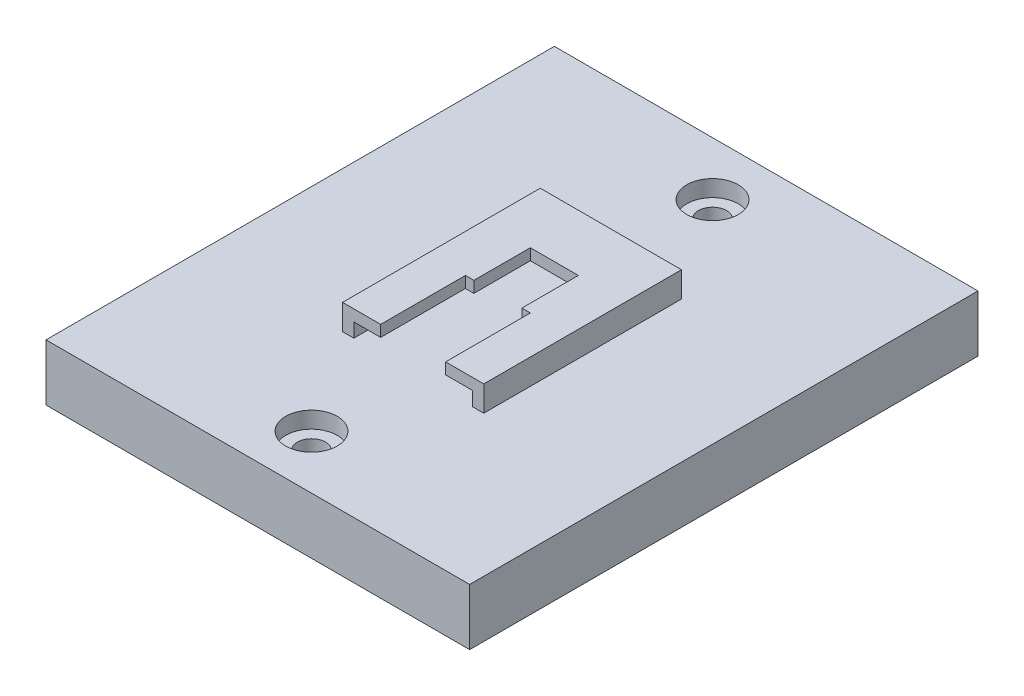
ISO-10303-21;
HEADER;
FILE_DESCRIPTION(('STEP AP214'),'2;1');
FILE_NAME('part.step','',(''),(''),'','','');
FILE_SCHEMA(('AUTOMOTIVE_DESIGN { 1 0 10303 214 1 1 1 1 }'));
ENDSEC;
DATA;
#1=APPLICATION_CONTEXT('core data for automotive mechanical design processes');
#2=APPLICATION_PROTOCOL_DEFINITION('international standard','automotive_design',2000,#1);
#3=PRODUCT_CONTEXT('',#1,'mechanical');
#4=PRODUCT('Part','Part','',(#3));
#5=PRODUCT_RELATED_PRODUCT_CATEGORY('part','',(#4));
#6=PRODUCT_DEFINITION_FORMATION('','',#4);
#7=PRODUCT_DEFINITION_CONTEXT('part definition',#1,'design');
#8=PRODUCT_DEFINITION('design','',#6,#7);
#9=PRODUCT_DEFINITION_SHAPE('','',#8);
#10=(LENGTH_UNIT() NAMED_UNIT(*) SI_UNIT(.MILLI.,.METRE.));
#11=(NAMED_UNIT(*) PLANE_ANGLE_UNIT() SI_UNIT($,.RADIAN.));
#12=(NAMED_UNIT(*) SI_UNIT($,.STERADIAN.) SOLID_ANGLE_UNIT());
#13=UNCERTAINTY_MEASURE_WITH_UNIT(LENGTH_MEASURE(1.E-05),#10,'distance_accuracy_value','');
#14=(GEOMETRIC_REPRESENTATION_CONTEXT(3) GLOBAL_UNCERTAINTY_ASSIGNED_CONTEXT((#13)) GLOBAL_UNIT_ASSIGNED_CONTEXT((#10,
#11,#12)) REPRESENTATION_CONTEXT('',''));
#15=CARTESIAN_POINT('',(0.,0.,0.));
#16=DIRECTION('',(0.,0.,1.));
#17=DIRECTION('',(1.,0.,0.));
#18=AXIS2_PLACEMENT_3D('',#15,#16,#17);
#19=CARTESIAN_POINT('',(0.,0.,0.));
#20=DIRECTION('',(0.,1.,0.));
#21=DIRECTION('',(0.,0.,1.));
#22=AXIS2_PLACEMENT_3D('',#19,#20,#21);
#23=PLANE('',#22);
#24=DIRECTION('',(0.,0.,1.));
#25=VECTOR('',#24,1.);
#26=CARTESIAN_POINT('',(-10.5,0.,-15.5));
#27=LINE('',#26,#25);
#28=CARTESIAN_POINT('',(-10.5,0.,-15.5));
#29=VERTEX_POINT('',#28);
#30=CARTESIAN_POINT('',(-10.5,0.,17.5));
#31=VERTEX_POINT('',#30);
#32=EDGE_CURVE('E64',#29,#31,#27,.T.);
#33=ORIENTED_EDGE('',*,*,#32,.F.);
#34=DIRECTION('',(-1.,0.,0.));
#35=VECTOR('',#34,1.);
#36=CARTESIAN_POINT('',(10.5,0.,-15.5));
#37=LINE('',#36,#35);
#38=CARTESIAN_POINT('',(10.5,0.,-15.5));
#39=VERTEX_POINT('',#38);
#40=EDGE_CURVE('E214',#39,#29,#37,.T.);
#41=ORIENTED_EDGE('',*,*,#40,.F.);
#42=DIRECTION('',(0.,0.,-1.));
#43=VECTOR('',#42,1.);
#44=CARTESIAN_POINT('',(10.5,0.,17.5));
#45=LINE('',#44,#43);
#46=CARTESIAN_POINT('',(10.5,0.,17.5));
#47=VERTEX_POINT('',#46);
#48=EDGE_CURVE('E66',#47,#39,#45,.T.);
#49=ORIENTED_EDGE('',*,*,#48,.F.);
#50=DIRECTION('',(1.,0.,0.));
#51=VECTOR('',#50,1.);
#52=CARTESIAN_POINT('',(0.,0.,17.5));
#53=LINE('',#52,#51);
#54=CARTESIAN_POINT('',(5.75000000000001,0.,17.5));
#55=VERTEX_POINT('',#54);
#56=EDGE_CURVE('E322',#55,#47,#53,.T.);
#57=ORIENTED_EDGE('',*,*,#56,.F.);
#58=DIRECTION('',(0.,0.,-1.));
#59=VECTOR('',#58,1.);
#60=CARTESIAN_POINT('',(5.75,0.,0.));
#61=LINE('',#60,#59);
#62=CARTESIAN_POINT('',(5.75,0.,2.5));
#63=VERTEX_POINT('',#62);
#64=EDGE_CURVE('E317',#55,#63,#61,.T.);
#65=ORIENTED_EDGE('',*,*,#64,.T.);
#66=DIRECTION('',(1.,0.,0.));
#67=VECTOR('',#66,1.);
#68=CARTESIAN_POINT('',(0.,0.,2.5));
#69=LINE('',#68,#67);
#70=CARTESIAN_POINT('',(4.25,0.,2.5));
#71=VERTEX_POINT('',#70);
#72=EDGE_CURVE('E312',#71,#63,#69,.T.);
#73=ORIENTED_EDGE('',*,*,#72,.F.);
#74=DIRECTION('',(0.,0.,-1.));
#75=VECTOR('',#74,1.);
#76=CARTESIAN_POINT('',(4.25,0.,0.));
#77=LINE('',#76,#75);
#78=CARTESIAN_POINT('',(4.25,0.,-7.5));
#79=VERTEX_POINT('',#78);
#80=EDGE_CURVE('E272',#71,#79,#77,.T.);
#81=ORIENTED_EDGE('',*,*,#80,.T.);
#82=DIRECTION('',(1.,0.,0.));
#83=VECTOR('',#82,1.);
#84=CARTESIAN_POINT('',(0.,0.,-7.5));
#85=LINE('',#84,#83);
#86=CARTESIAN_POINT('',(-4.25,0.,-7.5));
#87=VERTEX_POINT('',#86);
#88=EDGE_CURVE('E276',#87,#79,#85,.T.);
#89=ORIENTED_EDGE('',*,*,#88,.F.);
#90=DIRECTION('',(0.,0.,-1.));
#91=VECTOR('',#90,1.);
#92=CARTESIAN_POINT('',(-4.25,0.,0.));
#93=LINE('',#92,#91);
#94=CARTESIAN_POINT('',(-4.25,0.,2.5));
#95=VERTEX_POINT('',#94);
#96=EDGE_CURVE('E332',#95,#87,#93,.T.);
#97=ORIENTED_EDGE('',*,*,#96,.F.);
#98=CARTESIAN_POINT('',(-5.75,0.,2.5));
#99=VERTEX_POINT('',#98);
#100=EDGE_CURVE('E319',#99,#95,#69,.T.);
#101=ORIENTED_EDGE('',*,*,#100,.F.);
#102=DIRECTION('',(0.,0.,-1.));
#103=VECTOR('',#102,1.);
#104=CARTESIAN_POINT('',(-5.75,0.,0.));
#105=LINE('',#104,#103);
#106=CARTESIAN_POINT('',(-5.74999999999999,0.,17.5));
#107=VERTEX_POINT('',#106);
#108=EDGE_CURVE('E327',#107,#99,#105,.T.);
#109=ORIENTED_EDGE('',*,*,#108,.F.);
#110=EDGE_CURVE('E330',#31,#107,#53,.T.);
#111=ORIENTED_EDGE('',*,*,#110,.F.);
#112=EDGE_LOOP('',(#33,#41,#49,#57,#65,#73,#81,#89,#97,#101,#109,#111));
#113=FACE_BOUND('',#112,.T.);
#114=ADVANCED_FACE('F50',(#113),#23,.F.);
#115=CARTESIAN_POINT('',(4.25,2.,0.));
#116=DIRECTION('',(-1.,0.,0.));
#117=DIRECTION('',(0.,0.,1.));
#118=AXIS2_PLACEMENT_3D('',#115,#116,#117);
#119=PLANE('',#118);
#120=ORIENTED_EDGE('',*,*,#80,.F.);
#121=DIRECTION('',(0.,-1.,0.));
#122=VECTOR('',#121,1.);
#123=CARTESIAN_POINT('',(4.25,2.,2.5));
#124=LINE('',#123,#122);
#125=CARTESIAN_POINT('',(4.25,2.,2.5));
#126=VERTEX_POINT('',#125);
#127=EDGE_CURVE('E11',#126,#71,#124,.T.);
#128=ORIENTED_EDGE('',*,*,#127,.F.);
#129=DIRECTION('',(0.,0.,-1.));
#130=VECTOR('',#129,1.);
#131=CARTESIAN_POINT('',(4.25,2.,0.));
#132=LINE('',#131,#130);
#133=CARTESIAN_POINT('',(4.25,2.,-7.5));
#134=VERTEX_POINT('',#133);
#135=EDGE_CURVE('E273',#126,#134,#132,.T.);
#136=ORIENTED_EDGE('',*,*,#135,.T.);
#137=DIRECTION('',(0.,-1.,0.));
#138=VECTOR('',#137,1.);
#139=CARTESIAN_POINT('',(4.25,2.,-7.5));
#140=LINE('',#139,#138);
#141=EDGE_CURVE('E313',#134,#79,#140,.T.);
#142=ORIENTED_EDGE('',*,*,#141,.T.);
#143=EDGE_LOOP('',(#120,#128,#136,#142));
#144=FACE_BOUND('',#143,.T.);
#145=ADVANCED_FACE('F47',(#144),#119,.T.);
#146=CARTESIAN_POINT('',(0.,2.,2.5));
#147=DIRECTION('',(0.,0.,-1.));
#148=DIRECTION('',(-1.,0.,0.));
#149=AXIS2_PLACEMENT_3D('',#146,#147,#148);
#150=PLANE('',#149);
#151=ORIENTED_EDGE('',*,*,#72,.T.);
#152=DIRECTION('',(0.,-1.,0.));
#153=VECTOR('',#152,1.);
#154=CARTESIAN_POINT('',(5.75,2.,2.5));
#155=LINE('',#154,#153);
#156=CARTESIAN_POINT('',(5.75,2.,2.5));
#157=VERTEX_POINT('',#156);
#158=EDGE_CURVE('E57',#157,#63,#155,.T.);
#159=ORIENTED_EDGE('',*,*,#158,.F.);
#160=DIRECTION('',(1.,0.,0.));
#161=VECTOR('',#160,1.);
#162=CARTESIAN_POINT('',(0.,2.,2.5));
#163=LINE('',#162,#161);
#164=EDGE_CURVE('E279',#126,#157,#163,.T.);
#165=ORIENTED_EDGE('',*,*,#164,.F.);
#166=ORIENTED_EDGE('',*,*,#127,.T.);
#167=EDGE_LOOP('',(#151,#159,#165,#166));
#168=FACE_BOUND('',#167,.T.);
#169=ADVANCED_FACE('F378',(#168),#150,.F.);
#170=CARTESIAN_POINT('',(5.75,2.,0.));
#171=DIRECTION('',(-1.,0.,0.));
#172=DIRECTION('',(0.,0.,1.));
#173=AXIS2_PLACEMENT_3D('',#170,#171,#172);
#174=PLANE('',#173);
#175=ORIENTED_EDGE('',*,*,#64,.F.);
#176=DIRECTION('',(0.,-1.,0.));
#177=VECTOR('',#176,1.);
#178=CARTESIAN_POINT('',(5.75000000000001,2.,17.5));
#179=LINE('',#178,#177);
#180=CARTESIAN_POINT('',(5.75000000000001,2.,17.5));
#181=VERTEX_POINT('',#180);
#182=EDGE_CURVE('E370',#181,#55,#179,.T.);
#183=ORIENTED_EDGE('',*,*,#182,.F.);
#184=DIRECTION('',(0.,0.,-1.));
#185=VECTOR('',#184,1.);
#186=CARTESIAN_POINT('',(5.75,2.,0.));
#187=LINE('',#186,#185);
#188=EDGE_CURVE('E282',#181,#157,#187,.T.);
#189=ORIENTED_EDGE('',*,*,#188,.T.);
#190=ORIENTED_EDGE('',*,*,#158,.T.);
#191=EDGE_LOOP('',(#175,#183,#189,#190));
#192=FACE_BOUND('',#191,.T.);
#193=ADVANCED_FACE('F373',(#192),#174,.T.);
#194=CARTESIAN_POINT('',(0.,2.,17.5));
#195=DIRECTION('',(0.,0.,-1.));
#196=DIRECTION('',(-1.,0.,0.));
#197=AXIS2_PLACEMENT_3D('',#194,#195,#196);
#198=PLANE('',#197);
#199=ORIENTED_EDGE('',*,*,#56,.T.);
#200=DIRECTION('',(0.,1.,0.));
#201=VECTOR('',#200,1.);
#202=CARTESIAN_POINT('',(10.5,-2.5,17.5));
#203=LINE('',#202,#201);
#204=CARTESIAN_POINT('',(10.5,-2.5,17.5));
#205=VERTEX_POINT('',#204);
#206=EDGE_CURVE('E267',#205,#47,#203,.T.);
#207=ORIENTED_EDGE('',*,*,#206,.F.);
#208=DIRECTION('',(-1.,0.,0.));
#209=VECTOR('',#208,1.);
#210=CARTESIAN_POINT('',(12.5,-2.5,17.5));
#211=LINE('',#210,#209);
#212=CARTESIAN_POINT('',(12.5,-2.5,17.5));
#213=VERTEX_POINT('',#212);
#214=EDGE_CURVE('E240',#213,#205,#211,.T.);
#215=ORIENTED_EDGE('',*,*,#214,.F.);
#216=DIRECTION('',(0.,-1.,0.));
#217=VECTOR('',#216,1.);
#218=CARTESIAN_POINT('',(12.5,2.,17.5));
#219=LINE('',#218,#217);
#220=CARTESIAN_POINT('',(12.5,2.,17.5));
#221=VERTEX_POINT('',#220);
#222=EDGE_CURVE('E365',#221,#213,#219,.T.);
#223=ORIENTED_EDGE('',*,*,#222,.F.);
#224=DIRECTION('',(1.,0.,0.));
#225=VECTOR('',#224,1.);
#226=CARTESIAN_POINT('',(0.,2.,17.5));
#227=LINE('',#226,#225);
#228=EDGE_CURVE('E289',#181,#221,#227,.T.);
#229=ORIENTED_EDGE('',*,*,#228,.F.);
#230=ORIENTED_EDGE('',*,*,#182,.T.);
#231=EDGE_LOOP('',(#199,#207,#215,#223,#229,#230));
#232=FACE_BOUND('',#231,.T.);
#233=ADVANCED_FACE('F381',(#232),#198,.F.);
#234=CARTESIAN_POINT('',(12.5,2.,0.));
#235=DIRECTION('',(1.,0.,0.));
#236=DIRECTION('',(0.,0.,-1.));
#237=AXIS2_PLACEMENT_3D('',#234,#235,#236);
#238=PLANE('',#237);
#239=ORIENTED_EDGE('',*,*,#222,.T.);
#240=DIRECTION('',(0.,0.,1.));
#241=VECTOR('',#240,1.);
#242=CARTESIAN_POINT('',(12.5,-2.5,-17.5));
#243=LINE('',#242,#241);
#244=CARTESIAN_POINT('',(12.5,-2.5,-17.5));
#245=VERTEX_POINT('',#244);
#246=EDGE_CURVE('E235',#245,#213,#243,.T.);
#247=ORIENTED_EDGE('',*,*,#246,.F.);
#248=DIRECTION('',(0.,-1.,0.));
#249=VECTOR('',#248,1.);
#250=CARTESIAN_POINT('',(12.5,2.,-17.5));
#251=LINE('',#250,#249);
#252=CARTESIAN_POINT('',(12.5,2.,-17.5));
#253=VERTEX_POINT('',#252);
#254=EDGE_CURVE('E363',#253,#245,#251,.T.);
#255=ORIENTED_EDGE('',*,*,#254,.F.);
#256=DIRECTION('',(0.,0.,1.));
#257=VECTOR('',#256,1.);
#258=CARTESIAN_POINT('',(12.5,2.,0.));
#259=LINE('',#258,#257);
#260=EDGE_CURVE('E288',#253,#221,#259,.T.);
#261=ORIENTED_EDGE('',*,*,#260,.T.);
#262=EDGE_LOOP('',(#239,#247,#255,#261));
#263=FACE_BOUND('',#262,.T.);
#264=ADVANCED_FACE('F393',(#263),#238,.T.);
#265=CARTESIAN_POINT('',(0.,2.,-17.5));
#266=DIRECTION('',(0.,0.,-1.));
#267=DIRECTION('',(-1.,0.,0.));
#268=AXIS2_PLACEMENT_3D('',#265,#266,#267);
#269=PLANE('',#268);
#270=ORIENTED_EDGE('',*,*,#254,.T.);
#271=DIRECTION('',(1.,0.,0.));
#272=VECTOR('',#271,1.);
#273=CARTESIAN_POINT('',(-12.5,-2.5,-17.5));
#274=LINE('',#273,#272);
#275=CARTESIAN_POINT('',(-12.5,-2.5,-17.5));
#276=VERTEX_POINT('',#275);
#277=EDGE_CURVE('E228',#276,#245,#274,.T.);
#278=ORIENTED_EDGE('',*,*,#277,.F.);
#279=DIRECTION('',(0.,-1.,0.));
#280=VECTOR('',#279,1.);
#281=CARTESIAN_POINT('',(-12.5,2.,-17.5));
#282=LINE('',#281,#280);
#283=CARTESIAN_POINT('',(-12.5,2.,-17.5));
#284=VERTEX_POINT('',#283);
#285=EDGE_CURVE('E360',#284,#276,#282,.T.);
#286=ORIENTED_EDGE('',*,*,#285,.F.);
#287=DIRECTION('',(1.,0.,0.));
#288=VECTOR('',#287,1.);
#289=CARTESIAN_POINT('',(0.,2.,-17.5));
#290=LINE('',#289,#288);
#291=EDGE_CURVE('E293',#284,#253,#290,.T.);
#292=ORIENTED_EDGE('',*,*,#291,.T.);
#293=EDGE_LOOP('',(#270,#278,#286,#292));
#294=FACE_BOUND('',#293,.T.);
#295=ADVANCED_FACE('F398',(#294),#269,.T.);
#296=CARTESIAN_POINT('',(-12.5,2.,0.));
#297=DIRECTION('',(1.,0.,0.));
#298=DIRECTION('',(0.,0.,-1.));
#299=AXIS2_PLACEMENT_3D('',#296,#297,#298);
#300=PLANE('',#299);
#301=ORIENTED_EDGE('',*,*,#285,.T.);
#302=DIRECTION('',(0.,0.,-1.));
#303=VECTOR('',#302,1.);
#304=CARTESIAN_POINT('',(-12.5,-2.5,17.5));
#305=LINE('',#304,#303);
#306=CARTESIAN_POINT('',(-12.5,-2.5,17.5));
#307=VERTEX_POINT('',#306);
#308=EDGE_CURVE('E223',#307,#276,#305,.T.);
#309=ORIENTED_EDGE('',*,*,#308,.F.);
#310=DIRECTION('',(0.,-1.,0.));
#311=VECTOR('',#310,1.);
#312=CARTESIAN_POINT('',(-12.5,2.,17.5));
#313=LINE('',#312,#311);
#314=CARTESIAN_POINT('',(-12.5,2.,17.5));
#315=VERTEX_POINT('',#314);
#316=EDGE_CURVE('E355',#315,#307,#313,.T.);
#317=ORIENTED_EDGE('',*,*,#316,.F.);
#318=DIRECTION('',(0.,0.,1.));
#319=VECTOR('',#318,1.);
#320=CARTESIAN_POINT('',(-12.5,2.,0.));
#321=LINE('',#320,#319);
#322=EDGE_CURVE('E298',#284,#315,#321,.T.);
#323=ORIENTED_EDGE('',*,*,#322,.F.);
#324=EDGE_LOOP('',(#301,#309,#317,#323));
#325=FACE_BOUND('',#324,.T.);
#326=ADVANCED_FACE('F406',(#325),#300,.F.);
#327=ORIENTED_EDGE('',*,*,#316,.T.);
#328=DIRECTION('',(-1.,0.,0.));
#329=VECTOR('',#328,1.);
#330=CARTESIAN_POINT('',(-10.5,-2.5,17.5));
#331=LINE('',#330,#329);
#332=CARTESIAN_POINT('',(-10.5,-2.5,17.5));
#333=VERTEX_POINT('',#332);
#334=EDGE_CURVE('E222',#333,#307,#331,.T.);
#335=ORIENTED_EDGE('',*,*,#334,.F.);
#336=DIRECTION('',(0.,1.,0.));
#337=VECTOR('',#336,1.);
#338=CARTESIAN_POINT('',(-10.5,-2.5,17.5));
#339=LINE('',#338,#337);
#340=EDGE_CURVE('E252',#333,#31,#339,.T.);
#341=ORIENTED_EDGE('',*,*,#340,.T.);
#342=ORIENTED_EDGE('',*,*,#110,.T.);
#343=DIRECTION('',(0.,-1.,0.));
#344=VECTOR('',#343,1.);
#345=CARTESIAN_POINT('',(-5.74999999999999,2.,17.5));
#346=LINE('',#345,#344);
#347=CARTESIAN_POINT('',(-5.74999999999999,2.,17.5));
#348=VERTEX_POINT('',#347);
#349=EDGE_CURVE('E351',#348,#107,#346,.T.);
#350=ORIENTED_EDGE('',*,*,#349,.F.);
#351=EDGE_CURVE('E292',#315,#348,#227,.T.);
#352=ORIENTED_EDGE('',*,*,#351,.F.);
#353=EDGE_LOOP('',(#327,#335,#341,#342,#350,#352));
#354=FACE_BOUND('',#353,.T.);
#355=ADVANCED_FACE('F415',(#354),#198,.F.);
#356=CARTESIAN_POINT('',(-5.75,2.,0.));
#357=DIRECTION('',(-1.,0.,0.));
#358=DIRECTION('',(0.,0.,1.));
#359=AXIS2_PLACEMENT_3D('',#356,#357,#358);
#360=PLANE('',#359);
#361=ORIENTED_EDGE('',*,*,#108,.T.);
#362=DIRECTION('',(0.,-1.,0.));
#363=VECTOR('',#362,1.);
#364=CARTESIAN_POINT('',(-5.75,2.,2.5));
#365=LINE('',#364,#363);
#366=CARTESIAN_POINT('',(-5.75,2.,2.5));
#367=VERTEX_POINT('',#366);
#368=EDGE_CURVE('E350',#367,#99,#365,.T.);
#369=ORIENTED_EDGE('',*,*,#368,.F.);
#370=DIRECTION('',(0.,0.,-1.));
#371=VECTOR('',#370,1.);
#372=CARTESIAN_POINT('',(-5.75,2.,0.));
#373=LINE('',#372,#371);
#374=EDGE_CURVE('E304',#348,#367,#373,.T.);
#375=ORIENTED_EDGE('',*,*,#374,.F.);
#376=ORIENTED_EDGE('',*,*,#349,.T.);
#377=EDGE_LOOP('',(#361,#369,#375,#376));
#378=FACE_BOUND('',#377,.T.);
#379=ADVANCED_FACE('F418',(#378),#360,.F.);
#380=ORIENTED_EDGE('',*,*,#100,.T.);
#381=DIRECTION('',(0.,-1.,0.));
#382=VECTOR('',#381,1.);
#383=CARTESIAN_POINT('',(-4.25,2.,2.5));
#384=LINE('',#383,#382);
#385=CARTESIAN_POINT('',(-4.25,2.,2.5));
#386=VERTEX_POINT('',#385);
#387=EDGE_CURVE('E345',#386,#95,#384,.T.);
#388=ORIENTED_EDGE('',*,*,#387,.F.);
#389=EDGE_CURVE('E284',#367,#386,#163,.T.);
#390=ORIENTED_EDGE('',*,*,#389,.F.);
#391=ORIENTED_EDGE('',*,*,#368,.T.);
#392=EDGE_LOOP('',(#380,#388,#390,#391));
#393=FACE_BOUND('',#392,.T.);
#394=ADVANCED_FACE('F423',(#393),#150,.F.);
#395=CARTESIAN_POINT('',(-4.25,2.,0.));
#396=DIRECTION('',(-1.,0.,0.));
#397=DIRECTION('',(0.,0.,1.));
#398=AXIS2_PLACEMENT_3D('',#395,#396,#397);
#399=PLANE('',#398);
#400=ORIENTED_EDGE('',*,*,#96,.T.);
#401=DIRECTION('',(0.,-1.,0.));
#402=VECTOR('',#401,1.);
#403=CARTESIAN_POINT('',(-4.25,2.,-7.5));
#404=LINE('',#403,#402);
#405=CARTESIAN_POINT('',(-4.25,2.,-7.5));
#406=VERTEX_POINT('',#405);
#407=EDGE_CURVE('E338',#406,#87,#404,.T.);
#408=ORIENTED_EDGE('',*,*,#407,.F.);
#409=DIRECTION('',(0.,0.,-1.));
#410=VECTOR('',#409,1.);
#411=CARTESIAN_POINT('',(-4.25,2.,0.));
#412=LINE('',#411,#410);
#413=EDGE_CURVE('E303',#386,#406,#412,.T.);
#414=ORIENTED_EDGE('',*,*,#413,.F.);
#415=ORIENTED_EDGE('',*,*,#387,.T.);
#416=EDGE_LOOP('',(#400,#408,#414,#415));
#417=FACE_BOUND('',#416,.T.);
#418=ADVANCED_FACE('F428',(#417),#399,.F.);
#419=CARTESIAN_POINT('',(0.,2.,-7.5));
#420=DIRECTION('',(0.,0.,-1.));
#421=DIRECTION('',(-1.,0.,0.));
#422=AXIS2_PLACEMENT_3D('',#419,#420,#421);
#423=PLANE('',#422);
#424=ORIENTED_EDGE('',*,*,#88,.T.);
#425=ORIENTED_EDGE('',*,*,#141,.F.);
#426=DIRECTION('',(1.,0.,0.));
#427=VECTOR('',#426,1.);
#428=CARTESIAN_POINT('',(0.,2.,-7.5));
#429=LINE('',#428,#427);
#430=EDGE_CURVE('E306',#406,#134,#429,.T.);
#431=ORIENTED_EDGE('',*,*,#430,.F.);
#432=ORIENTED_EDGE('',*,*,#407,.T.);
#433=EDGE_LOOP('',(#424,#425,#431,#432));
#434=FACE_BOUND('',#433,.T.);
#435=ADVANCED_FACE('F433',(#434),#423,.F.);
#436=CARTESIAN_POINT('',(0.,2.,0.));
#437=DIRECTION('',(0.,1.,0.));
#438=DIRECTION('',(0.,0.,1.));
#439=AXIS2_PLACEMENT_3D('',#436,#437,#438);
#440=PLANE('',#439);
#441=ORIENTED_EDGE('',*,*,#135,.F.);
#442=ORIENTED_EDGE('',*,*,#164,.T.);
#443=ORIENTED_EDGE('',*,*,#188,.F.);
#444=ORIENTED_EDGE('',*,*,#228,.T.);
#445=ORIENTED_EDGE('',*,*,#260,.F.);
#446=ORIENTED_EDGE('',*,*,#291,.F.);
#447=ORIENTED_EDGE('',*,*,#322,.T.);
#448=ORIENTED_EDGE('',*,*,#351,.T.);
#449=ORIENTED_EDGE('',*,*,#374,.T.);
#450=ORIENTED_EDGE('',*,*,#389,.T.);
#451=ORIENTED_EDGE('',*,*,#413,.T.);
#452=ORIENTED_EDGE('',*,*,#430,.T.);
#453=EDGE_LOOP('',(#441,#442,#443,#444,#445,#446,#447,#448,#449,#450,#451,#452));
#454=FACE_BOUND('',#453,.T.);
#455=ADVANCED_FACE('F400',(#454),#440,.T.);
#456=CARTESIAN_POINT('',(10.5,-2.5,17.5));
#457=DIRECTION('',(1.,0.,0.));
#458=DIRECTION('',(0.,0.,-1.));
#459=AXIS2_PLACEMENT_3D('',#456,#457,#458);
#460=PLANE('',#459);
#461=ORIENTED_EDGE('',*,*,#48,.T.);
#462=DIRECTION('',(0.,1.,0.));
#463=VECTOR('',#462,1.);
#464=CARTESIAN_POINT('',(10.5,-2.5,-15.5));
#465=LINE('',#464,#463);
#466=CARTESIAN_POINT('',(10.5,-2.5,-15.5));
#467=VERTEX_POINT('',#466);
#468=EDGE_CURVE('E264',#467,#39,#465,.T.);
#469=ORIENTED_EDGE('',*,*,#468,.F.);
#470=DIRECTION('',(0.,0.,-1.));
#471=VECTOR('',#470,1.);
#472=CARTESIAN_POINT('',(10.5,-2.5,17.5));
#473=LINE('',#472,#471);
#474=EDGE_CURVE('E241',#205,#467,#473,.T.);
#475=ORIENTED_EDGE('',*,*,#474,.F.);
#476=ORIENTED_EDGE('',*,*,#206,.T.);
#477=EDGE_LOOP('',(#461,#469,#475,#476));
#478=FACE_BOUND('',#477,.T.);
#479=ADVANCED_FACE('F387',(#478),#460,.F.);
#480=CARTESIAN_POINT('',(10.5,-2.5,-15.5));
#481=DIRECTION('',(0.,0.,-1.));
#482=DIRECTION('',(-1.,0.,0.));
#483=AXIS2_PLACEMENT_3D('',#480,#481,#482);
#484=PLANE('',#483);
#485=ORIENTED_EDGE('',*,*,#40,.T.);
#486=DIRECTION('',(0.,1.,0.));
#487=VECTOR('',#486,1.);
#488=CARTESIAN_POINT('',(-10.5,-2.5,-15.5));
#489=LINE('',#488,#487);
#490=CARTESIAN_POINT('',(-10.5,-2.5,-15.5));
#491=VERTEX_POINT('',#490);
#492=EDGE_CURVE('E261',#491,#29,#489,.T.);
#493=ORIENTED_EDGE('',*,*,#492,.F.);
#494=DIRECTION('',(-1.,0.,0.));
#495=VECTOR('',#494,1.);
#496=CARTESIAN_POINT('',(10.5,-2.5,-15.5));
#497=LINE('',#496,#495);
#498=EDGE_CURVE('E245',#467,#491,#497,.T.);
#499=ORIENTED_EDGE('',*,*,#498,.F.);
#500=ORIENTED_EDGE('',*,*,#468,.T.);
#501=EDGE_LOOP('',(#485,#493,#499,#500));
#502=FACE_BOUND('',#501,.T.);
#503=ADVANCED_FACE('F500',(#502),#484,.F.);
#504=CARTESIAN_POINT('',(-10.5,-2.5,-15.5));
#505=DIRECTION('',(-1.,0.,0.));
#506=DIRECTION('',(0.,0.,1.));
#507=AXIS2_PLACEMENT_3D('',#504,#505,#506);
#508=PLANE('',#507);
#509=ORIENTED_EDGE('',*,*,#32,.T.);
#510=ORIENTED_EDGE('',*,*,#340,.F.);
#511=DIRECTION('',(0.,0.,1.));
#512=VECTOR('',#511,1.);
#513=CARTESIAN_POINT('',(-10.5,-2.5,-15.5));
#514=LINE('',#513,#512);
#515=EDGE_CURVE('E246',#491,#333,#514,.T.);
#516=ORIENTED_EDGE('',*,*,#515,.F.);
#517=ORIENTED_EDGE('',*,*,#492,.T.);
#518=EDGE_LOOP('',(#509,#510,#516,#517));
#519=FACE_BOUND('',#518,.T.);
#520=ADVANCED_FACE('F503',(#519),#508,.F.);
#521=CARTESIAN_POINT('',(0.,-2.5,0.));
#522=DIRECTION('',(0.,-1.,0.));
#523=DIRECTION('',(0.,0.,-1.));
#524=AXIS2_PLACEMENT_3D('',#521,#522,#523);
#525=PLANE('',#524);
#526=CARTESIAN_POINT('',(0.,-2.5,-35.5));
#527=DIRECTION('',(0.,1.,0.));
#528=DIRECTION('',(0.,0.,1.));
#529=AXIS2_PLACEMENT_3D('',#526,#527,#528);
#530=CIRCLE('',#529,4.56438);
#531=CARTESIAN_POINT('',(0.,-2.5,-30.93562));
#532=VERTEX_POINT('',#531);
#533=EDGE_CURVE('E710',#532,#532,#530,.T.);
#534=ORIENTED_EDGE('',*,*,#533,.F.);
#535=EDGE_LOOP('',(#534));
#536=FACE_BOUND('',#535,.T.);
#537=CARTESIAN_POINT('',(0.,-2.5,35.5));
#538=DIRECTION('',(0.,1.,0.));
#539=DIRECTION('',(0.,0.,1.));
#540=AXIS2_PLACEMENT_3D('',#537,#538,#539);
#541=CIRCLE('',#540,4.56438);
#542=CARTESIAN_POINT('',(0.,-2.5,40.06438));
#543=VERTEX_POINT('',#542);
#544=EDGE_CURVE('E721',#543,#543,#541,.T.);
#545=ORIENTED_EDGE('',*,*,#544,.F.);
#546=EDGE_LOOP('',(#545));
#547=FACE_BOUND('',#546,.T.);
#548=DIRECTION('',(0.,0.,1.));
#549=VECTOR('',#548,1.);
#550=CARTESIAN_POINT('',(37.5,-2.5,45.));
#551=LINE('',#550,#549);
#552=CARTESIAN_POINT('',(37.5,-2.5,-45.));
#553=VERTEX_POINT('',#552);
#554=CARTESIAN_POINT('',(37.5,-2.5,45.));
#555=VERTEX_POINT('',#554);
#556=EDGE_CURVE('E209',#553,#555,#551,.T.);
#557=ORIENTED_EDGE('',*,*,#556,.F.);
#558=DIRECTION('',(1.,0.,0.));
#559=VECTOR('',#558,1.);
#560=CARTESIAN_POINT('',(-37.5,-2.5,-45.));
#561=LINE('',#560,#559);
#562=CARTESIAN_POINT('',(-37.5,-2.5,-45.));
#563=VERTEX_POINT('',#562);
#564=EDGE_CURVE('E206',#563,#553,#561,.T.);
#565=ORIENTED_EDGE('',*,*,#564,.F.);
#566=DIRECTION('',(0.,0.,-1.));
#567=VECTOR('',#566,1.);
#568=CARTESIAN_POINT('',(-37.5,-2.5,45.));
#569=LINE('',#568,#567);
#570=CARTESIAN_POINT('',(-37.5,-2.5,45.));
#571=VERTEX_POINT('',#570);
#572=EDGE_CURVE('E747',#571,#563,#569,.T.);
#573=ORIENTED_EDGE('',*,*,#572,.F.);
#574=DIRECTION('',(-1.,0.,0.));
#575=VECTOR('',#574,1.);
#576=CARTESIAN_POINT('',(-37.5,-2.5,45.));
#577=LINE('',#576,#575);
#578=EDGE_CURVE('E741',#555,#571,#577,.T.);
#579=ORIENTED_EDGE('',*,*,#578,.F.);
#580=EDGE_LOOP('',(#557,#565,#573,#579));
#581=FACE_BOUND('',#580,.T.);
#582=ORIENTED_EDGE('',*,*,#515,.T.);
#583=ORIENTED_EDGE('',*,*,#334,.T.);
#584=ORIENTED_EDGE('',*,*,#308,.T.);
#585=ORIENTED_EDGE('',*,*,#277,.T.);
#586=ORIENTED_EDGE('',*,*,#246,.T.);
#587=ORIENTED_EDGE('',*,*,#214,.T.);
#588=ORIENTED_EDGE('',*,*,#474,.T.);
#589=ORIENTED_EDGE('',*,*,#498,.T.);
#590=EDGE_LOOP('',(#582,#583,#584,#585,#586,#587,#588,#589));
#591=FACE_BOUND('',#590,.T.);
#592=ADVANCED_FACE('F386',(#536,#547,#581,#591),#525,.F.);
#593=CARTESIAN_POINT('',(37.5,-12.5,45.));
#594=DIRECTION('',(-1.,0.,0.));
#595=DIRECTION('',(0.,0.,1.));
#596=AXIS2_PLACEMENT_3D('',#593,#594,#595);
#597=PLANE('',#596);
#598=ORIENTED_EDGE('',*,*,#556,.T.);
#599=DIRECTION('',(0.,1.,0.));
#600=VECTOR('',#599,1.);
#601=CARTESIAN_POINT('',(37.5,-12.5,45.));
#602=LINE('',#601,#600);
#603=CARTESIAN_POINT('',(37.5,-12.5,45.));
#604=VERTEX_POINT('',#603);
#605=EDGE_CURVE('E189',#604,#555,#602,.T.);
#606=ORIENTED_EDGE('',*,*,#605,.F.);
#607=DIRECTION('',(0.,0.,1.));
#608=VECTOR('',#607,1.);
#609=CARTESIAN_POINT('',(37.5,-12.5,45.));
#610=LINE('',#609,#608);
#611=CARTESIAN_POINT('',(37.5,-12.5,-45.));
#612=VERTEX_POINT('',#611);
#613=EDGE_CURVE('E198',#612,#604,#610,.T.);
#614=ORIENTED_EDGE('',*,*,#613,.F.);
#615=DIRECTION('',(0.,1.,0.));
#616=VECTOR('',#615,1.);
#617=CARTESIAN_POINT('',(37.5,-12.5,-45.));
#618=LINE('',#617,#616);
#619=EDGE_CURVE('E742',#612,#553,#618,.T.);
#620=ORIENTED_EDGE('',*,*,#619,.T.);
#621=EDGE_LOOP('',(#598,#606,#614,#620));
#622=FACE_BOUND('',#621,.T.);
#623=ADVANCED_FACE('F208',(#622),#597,.F.);
#624=CARTESIAN_POINT('',(-37.5,-12.5,45.));
#625=DIRECTION('',(0.,0.,-1.));
#626=DIRECTION('',(-1.,0.,0.));
#627=AXIS2_PLACEMENT_3D('',#624,#625,#626);
#628=PLANE('',#627);
#629=ORIENTED_EDGE('',*,*,#578,.T.);
#630=DIRECTION('',(0.,1.,0.));
#631=VECTOR('',#630,1.);
#632=CARTESIAN_POINT('',(-37.5,-12.5,45.));
#633=LINE('',#632,#631);
#634=CARTESIAN_POINT('',(-37.5,-12.5,45.));
#635=VERTEX_POINT('',#634);
#636=EDGE_CURVE('E192',#635,#571,#633,.T.);
#637=ORIENTED_EDGE('',*,*,#636,.F.);
#638=DIRECTION('',(-1.,0.,0.));
#639=VECTOR('',#638,1.);
#640=CARTESIAN_POINT('',(-37.5,-12.5,45.));
#641=LINE('',#640,#639);
#642=EDGE_CURVE('E184',#604,#635,#641,.T.);
#643=ORIENTED_EDGE('',*,*,#642,.F.);
#644=ORIENTED_EDGE('',*,*,#605,.T.);
#645=EDGE_LOOP('',(#629,#637,#643,#644));
#646=FACE_BOUND('',#645,.T.);
#647=ADVANCED_FACE('F186',(#646),#628,.F.);
#648=CARTESIAN_POINT('',(-37.5,-12.5,45.));
#649=DIRECTION('',(1.,0.,0.));
#650=DIRECTION('',(0.,0.,-1.));
#651=AXIS2_PLACEMENT_3D('',#648,#649,#650);
#652=PLANE('',#651);
#653=ORIENTED_EDGE('',*,*,#572,.T.);
#654=DIRECTION('',(0.,1.,0.));
#655=VECTOR('',#654,1.);
#656=CARTESIAN_POINT('',(-37.5,-12.5,-45.));
#657=LINE('',#656,#655);
#658=CARTESIAN_POINT('',(-37.5,-12.5,-45.));
#659=VERTEX_POINT('',#658);
#660=EDGE_CURVE('E220',#659,#563,#657,.T.);
#661=ORIENTED_EDGE('',*,*,#660,.F.);
#662=DIRECTION('',(0.,0.,-1.));
#663=VECTOR('',#662,1.);
#664=CARTESIAN_POINT('',(-37.5,-12.5,45.));
#665=LINE('',#664,#663);
#666=EDGE_CURVE('E193',#635,#659,#665,.T.);
#667=ORIENTED_EDGE('',*,*,#666,.F.);
#668=ORIENTED_EDGE('',*,*,#636,.T.);
#669=EDGE_LOOP('',(#653,#661,#667,#668));
#670=FACE_BOUND('',#669,.T.);
#671=ADVANCED_FACE('F530',(#670),#652,.F.);
#672=CARTESIAN_POINT('',(-37.5,-12.5,-45.));
#673=DIRECTION('',(0.,0.,1.));
#674=DIRECTION('',(1.,0.,0.));
#675=AXIS2_PLACEMENT_3D('',#672,#673,#674);
#676=PLANE('',#675);
#677=ORIENTED_EDGE('',*,*,#564,.T.);
#678=ORIENTED_EDGE('',*,*,#619,.F.);
#679=DIRECTION('',(1.,0.,0.));
#680=VECTOR('',#679,1.);
#681=CARTESIAN_POINT('',(-37.5,-12.5,-45.));
#682=LINE('',#681,#680);
#683=EDGE_CURVE('E203',#659,#612,#682,.T.);
#684=ORIENTED_EDGE('',*,*,#683,.F.);
#685=ORIENTED_EDGE('',*,*,#660,.T.);
#686=EDGE_LOOP('',(#677,#678,#684,#685));
#687=FACE_BOUND('',#686,.T.);
#688=ADVANCED_FACE('F540',(#687),#676,.F.);
#689=CARTESIAN_POINT('',(0.,-12.5,0.));
#690=DIRECTION('',(0.,-1.,0.));
#691=DIRECTION('',(0.,0.,-1.));
#692=AXIS2_PLACEMENT_3D('',#689,#690,#691);
#693=PLANE('',#692);
#694=CARTESIAN_POINT('',(0.,-12.5,-35.5));
#695=DIRECTION('',(0.,1.,0.));
#696=DIRECTION('',(0.,0.,1.));
#697=AXIS2_PLACEMENT_3D('',#694,#695,#696);
#698=CIRCLE('',#697,2.4892);
#699=CARTESIAN_POINT('',(0.,-12.5,-33.0108));
#700=VERTEX_POINT('',#699);
#701=EDGE_CURVE('E720',#700,#700,#698,.T.);
#702=ORIENTED_EDGE('',*,*,#701,.T.);
#703=EDGE_LOOP('',(#702));
#704=FACE_BOUND('',#703,.T.);
#705=CARTESIAN_POINT('',(0.,-12.5,35.5));
#706=DIRECTION('',(0.,1.,0.));
#707=DIRECTION('',(0.,0.,1.));
#708=AXIS2_PLACEMENT_3D('',#705,#706,#707);
#709=CIRCLE('',#708,2.4892);
#710=CARTESIAN_POINT('',(0.,-12.5,37.9892));
#711=VERTEX_POINT('',#710);
#712=EDGE_CURVE('E731',#711,#711,#709,.T.);
#713=ORIENTED_EDGE('',*,*,#712,.T.);
#714=EDGE_LOOP('',(#713));
#715=FACE_BOUND('',#714,.T.);
#716=ORIENTED_EDGE('',*,*,#613,.T.);
#717=ORIENTED_EDGE('',*,*,#642,.T.);
#718=ORIENTED_EDGE('',*,*,#666,.T.);
#719=ORIENTED_EDGE('',*,*,#683,.T.);
#720=EDGE_LOOP('',(#716,#717,#718,#719));
#721=FACE_BOUND('',#720,.T.);
#722=ADVANCED_FACE('F200',(#704,#715,#721),#693,.T.);
#723=CARTESIAN_POINT('',(0.,-2.5,35.5));
#724=DIRECTION('',(0.,1.,0.));
#725=DIRECTION('',(0.,0.,1.));
#726=AXIS2_PLACEMENT_3D('',#723,#724,#725);
#727=CYLINDRICAL_SURFACE('',#726,2.4892);
#728=ORIENTED_EDGE('',*,*,#712,.F.);
#729=EDGE_LOOP('',(#728));
#730=FACE_BOUND('',#729,.T.);
#731=CARTESIAN_POINT('',(0.,-5.421,35.5));
#732=DIRECTION('',(0.,1.,0.));
#733=DIRECTION('',(0.,0.,1.));
#734=AXIS2_PLACEMENT_3D('',#731,#732,#733);
#735=CIRCLE('',#734,2.4892);
#736=CARTESIAN_POINT('',(0.,-5.421,37.9892));
#737=VERTEX_POINT('',#736);
#738=EDGE_CURVE('E726',#737,#737,#735,.T.);
#739=ORIENTED_EDGE('',*,*,#738,.T.);
#740=EDGE_LOOP('',(#739));
#741=FACE_BOUND('',#740,.T.);
#742=ADVANCED_FACE('F562',(#730,#741),#727,.F.);
#743=CARTESIAN_POINT('',(2.4892,-5.421,35.5));
#744=DIRECTION('',(0.,-1.,0.));
#745=DIRECTION('',(0.,0.,-1.));
#746=AXIS2_PLACEMENT_3D('',#743,#744,#745);
#747=PLANE('',#746);
#748=ORIENTED_EDGE('',*,*,#738,.F.);
#749=EDGE_LOOP('',(#748));
#750=FACE_BOUND('',#749,.T.);
#751=CARTESIAN_POINT('',(0.,-5.421,35.5));
#752=DIRECTION('',(0.,1.,0.));
#753=DIRECTION('',(0.,0.,1.));
#754=AXIS2_PLACEMENT_3D('',#751,#752,#753);
#755=CIRCLE('',#754,4.56438);
#756=CARTESIAN_POINT('',(0.,-5.421,40.06438));
#757=VERTEX_POINT('',#756);
#758=EDGE_CURVE('E725',#757,#757,#755,.T.);
#759=ORIENTED_EDGE('',*,*,#758,.T.);
#760=EDGE_LOOP('',(#759));
#761=FACE_BOUND('',#760,.T.);
#762=ADVANCED_FACE('F568',(#750,#761),#747,.F.);
#763=CARTESIAN_POINT('',(0.,-2.5,35.5));
#764=DIRECTION('',(0.,1.,0.));
#765=DIRECTION('',(0.,0.,1.));
#766=AXIS2_PLACEMENT_3D('',#763,#764,#765);
#767=CYLINDRICAL_SURFACE('',#766,4.56438);
#768=ORIENTED_EDGE('',*,*,#758,.F.);
#769=EDGE_LOOP('',(#768));
#770=FACE_BOUND('',#769,.T.);
#771=ORIENTED_EDGE('',*,*,#544,.T.);
#772=EDGE_LOOP('',(#771));
#773=FACE_BOUND('',#772,.T.);
#774=ADVANCED_FACE('F576',(#770,#773),#767,.F.);
#775=CARTESIAN_POINT('',(0.,-2.5,-35.5));
#776=DIRECTION('',(0.,1.,0.));
#777=DIRECTION('',(0.,0.,1.));
#778=AXIS2_PLACEMENT_3D('',#775,#776,#777);
#779=CYLINDRICAL_SURFACE('',#778,2.4892);
#780=ORIENTED_EDGE('',*,*,#701,.F.);
#781=EDGE_LOOP('',(#780));
#782=FACE_BOUND('',#781,.T.);
#783=CARTESIAN_POINT('',(0.,-5.421,-35.5));
#784=DIRECTION('',(0.,1.,0.));
#785=DIRECTION('',(0.,0.,1.));
#786=AXIS2_PLACEMENT_3D('',#783,#784,#785);
#787=CIRCLE('',#786,2.4892);
#788=CARTESIAN_POINT('',(0.,-5.421,-33.0108));
#789=VERTEX_POINT('',#788);
#790=EDGE_CURVE('E711',#789,#789,#787,.T.);
#791=ORIENTED_EDGE('',*,*,#790,.T.);
#792=EDGE_LOOP('',(#791));
#793=FACE_BOUND('',#792,.T.);
#794=ADVANCED_FACE('F586',(#782,#793),#779,.F.);
#795=CARTESIAN_POINT('',(2.4892,-5.421,-35.5));
#796=DIRECTION('',(0.,-1.,0.));
#797=DIRECTION('',(0.,0.,-1.));
#798=AXIS2_PLACEMENT_3D('',#795,#796,#797);
#799=PLANE('',#798);
#800=ORIENTED_EDGE('',*,*,#790,.F.);
#801=EDGE_LOOP('',(#800));
#802=FACE_BOUND('',#801,.T.);
#803=CARTESIAN_POINT('',(0.,-5.421,-35.5));
#804=DIRECTION('',(0.,1.,0.));
#805=DIRECTION('',(0.,0.,1.));
#806=AXIS2_PLACEMENT_3D('',#803,#804,#805);
#807=CIRCLE('',#806,4.56438);
#808=CARTESIAN_POINT('',(0.,-5.421,-30.93562));
#809=VERTEX_POINT('',#808);
#810=EDGE_CURVE('E702',#809,#809,#807,.T.);
#811=ORIENTED_EDGE('',*,*,#810,.T.);
#812=EDGE_LOOP('',(#811));
#813=FACE_BOUND('',#812,.T.);
#814=ADVANCED_FACE('F600',(#802,#813),#799,.F.);
#815=CARTESIAN_POINT('',(0.,-2.5,-35.5));
#816=DIRECTION('',(0.,1.,0.));
#817=DIRECTION('',(0.,0.,1.));
#818=AXIS2_PLACEMENT_3D('',#815,#816,#817);
#819=CYLINDRICAL_SURFACE('',#818,4.56438);
#820=ORIENTED_EDGE('',*,*,#810,.F.);
#821=EDGE_LOOP('',(#820));
#822=FACE_BOUND('',#821,.T.);
#823=ORIENTED_EDGE('',*,*,#533,.T.);
#824=EDGE_LOOP('',(#823));
#825=FACE_BOUND('',#824,.T.);
#826=ADVANCED_FACE('F607',(#822,#825),#819,.F.);
#827=CLOSED_SHELL('',(#114,#145,#169,#193,#233,#264,#295,#326,#355,#379,#394,#418,#435,#455,
#479,#503,#520,#592,#623,#647,#671,#688,#722,#742,#762,#774,#794,#814,#826));
#828=MANIFOLD_SOLID_BREP('B2',#827);
#829=ADVANCED_BREP_SHAPE_REPRESENTATION('',(#18,#828),#14);
#830=SHAPE_DEFINITION_REPRESENTATION(#9,#829);
ENDSEC;
END-ISO-10303-21;
